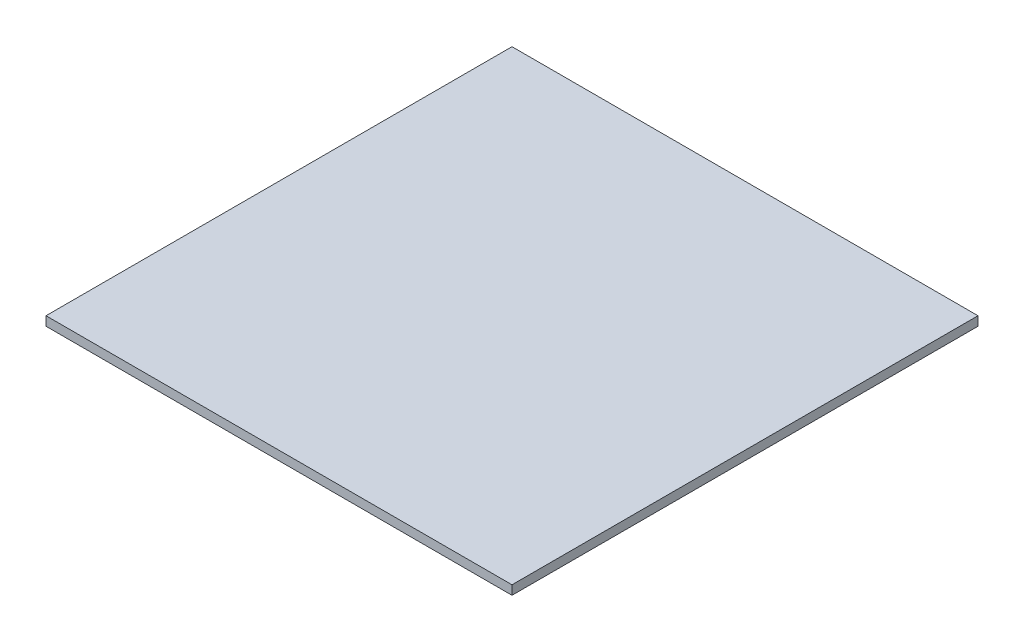
ISO-10303-21;
HEADER;
FILE_DESCRIPTION(('STEP AP214'),'2;1');
FILE_NAME('part.step','',(''),(''),'','','');
FILE_SCHEMA(('AUTOMOTIVE_DESIGN { 1 0 10303 214 1 1 1 1 }'));
ENDSEC;
DATA;
#1=APPLICATION_CONTEXT('core data for automotive mechanical design processes');
#2=APPLICATION_PROTOCOL_DEFINITION('international standard','automotive_design',2000,#1);
#3=PRODUCT_CONTEXT('',#1,'mechanical');
#4=PRODUCT('Part','Part','',(#3));
#5=PRODUCT_RELATED_PRODUCT_CATEGORY('part','',(#4));
#6=PRODUCT_DEFINITION_FORMATION('','',#4);
#7=PRODUCT_DEFINITION_CONTEXT('part definition',#1,'design');
#8=PRODUCT_DEFINITION('design','',#6,#7);
#9=PRODUCT_DEFINITION_SHAPE('','',#8);
#10=(LENGTH_UNIT() NAMED_UNIT(*) SI_UNIT(.MILLI.,.METRE.));
#11=(NAMED_UNIT(*) PLANE_ANGLE_UNIT() SI_UNIT($,.RADIAN.));
#12=(NAMED_UNIT(*) SI_UNIT($,.STERADIAN.) SOLID_ANGLE_UNIT());
#13=UNCERTAINTY_MEASURE_WITH_UNIT(LENGTH_MEASURE(1.E-05),#10,'distance_accuracy_value','');
#14=(GEOMETRIC_REPRESENTATION_CONTEXT(3) GLOBAL_UNCERTAINTY_ASSIGNED_CONTEXT((#13)) GLOBAL_UNIT_ASSIGNED_CONTEXT((#10,
#11,#12)) REPRESENTATION_CONTEXT('',''));
#15=CARTESIAN_POINT('',(0.,0.,0.));
#16=DIRECTION('',(0.,0.,1.));
#17=DIRECTION('',(1.,0.,0.));
#18=AXIS2_PLACEMENT_3D('',#15,#16,#17);
#19=CARTESIAN_POINT('',(0.,10.,0.));
#20=DIRECTION('',(1.,0.,0.));
#21=DIRECTION('',(0.,0.,-1.));
#22=AXIS2_PLACEMENT_3D('',#19,#20,#21);
#23=PLANE('',#22);
#24=DIRECTION('',(0.,0.,1.));
#25=VECTOR('',#24,1.);
#26=CARTESIAN_POINT('',(0.,0.,0.));
#27=LINE('',#26,#25);
#28=CARTESIAN_POINT('',(0.,0.,0.));
#29=VERTEX_POINT('',#28);
#30=CARTESIAN_POINT('',(0.,0.,510.));
#31=VERTEX_POINT('',#30);
#32=EDGE_CURVE('E106',#29,#31,#27,.T.);
#33=ORIENTED_EDGE('',*,*,#32,.T.);
#34=DIRECTION('',(0.,-1.,0.));
#35=VECTOR('',#34,1.);
#36=CARTESIAN_POINT('',(0.,10.,510.));
#37=LINE('',#36,#35);
#38=CARTESIAN_POINT('',(0.,10.,510.));
#39=VERTEX_POINT('',#38);
#40=EDGE_CURVE('E11',#39,#31,#37,.T.);
#41=ORIENTED_EDGE('',*,*,#40,.F.);
#42=DIRECTION('',(0.,0.,1.));
#43=VECTOR('',#42,1.);
#44=CARTESIAN_POINT('',(0.,10.,0.));
#45=LINE('',#44,#43);
#46=CARTESIAN_POINT('',(0.,10.,0.));
#47=VERTEX_POINT('',#46);
#48=EDGE_CURVE('E94',#47,#39,#45,.T.);
#49=ORIENTED_EDGE('',*,*,#48,.F.);
#50=DIRECTION('',(0.,-1.,0.));
#51=VECTOR('',#50,1.);
#52=CARTESIAN_POINT('',(0.,10.,0.));
#53=LINE('',#52,#51);
#54=EDGE_CURVE('E102',#47,#29,#53,.T.);
#55=ORIENTED_EDGE('',*,*,#54,.T.);
#56=EDGE_LOOP('',(#33,#41,#49,#55));
#57=FACE_BOUND('',#56,.T.);
#58=ADVANCED_FACE('F43',(#57),#23,.F.);
#59=CARTESIAN_POINT('',(0.,10.,510.));
#60=DIRECTION('',(0.,0.,-1.));
#61=DIRECTION('',(-1.,0.,0.));
#62=AXIS2_PLACEMENT_3D('',#59,#60,#61);
#63=PLANE('',#62);
#64=DIRECTION('',(1.,0.,0.));
#65=VECTOR('',#64,1.);
#66=CARTESIAN_POINT('',(0.,0.,510.));
#67=LINE('',#66,#65);
#68=CARTESIAN_POINT('',(510.,0.,510.));
#69=VERTEX_POINT('',#68);
#70=EDGE_CURVE('E98',#31,#69,#67,.T.);
#71=ORIENTED_EDGE('',*,*,#70,.T.);
#72=DIRECTION('',(0.,-1.,0.));
#73=VECTOR('',#72,1.);
#74=CARTESIAN_POINT('',(510.,10.,510.));
#75=LINE('',#74,#73);
#76=CARTESIAN_POINT('',(510.,10.,510.));
#77=VERTEX_POINT('',#76);
#78=EDGE_CURVE('E51',#77,#69,#75,.T.);
#79=ORIENTED_EDGE('',*,*,#78,.F.);
#80=DIRECTION('',(1.,0.,0.));
#81=VECTOR('',#80,1.);
#82=CARTESIAN_POINT('',(0.,10.,510.));
#83=LINE('',#82,#81);
#84=EDGE_CURVE('E89',#39,#77,#83,.T.);
#85=ORIENTED_EDGE('',*,*,#84,.F.);
#86=ORIENTED_EDGE('',*,*,#40,.T.);
#87=EDGE_LOOP('',(#71,#79,#85,#86));
#88=FACE_BOUND('',#87,.T.);
#89=ADVANCED_FACE('F97',(#88),#63,.F.);
#90=CARTESIAN_POINT('',(510.,10.,0.));
#91=DIRECTION('',(-1.,0.,0.));
#92=DIRECTION('',(0.,0.,1.));
#93=AXIS2_PLACEMENT_3D('',#90,#91,#92);
#94=PLANE('',#93);
#95=DIRECTION('',(0.,0.,-1.));
#96=VECTOR('',#95,1.);
#97=CARTESIAN_POINT('',(510.,0.,0.));
#98=LINE('',#97,#96);
#99=CARTESIAN_POINT('',(510.,0.,0.));
#100=VERTEX_POINT('',#99);
#101=EDGE_CURVE('E76',#69,#100,#98,.T.);
#102=ORIENTED_EDGE('',*,*,#101,.T.);
#103=DIRECTION('',(0.,-1.,0.));
#104=VECTOR('',#103,1.);
#105=CARTESIAN_POINT('',(510.,10.,0.));
#106=LINE('',#105,#104);
#107=CARTESIAN_POINT('',(510.,10.,0.));
#108=VERTEX_POINT('',#107);
#109=EDGE_CURVE('E99',#108,#100,#106,.T.);
#110=ORIENTED_EDGE('',*,*,#109,.F.);
#111=DIRECTION('',(0.,0.,-1.));
#112=VECTOR('',#111,1.);
#113=CARTESIAN_POINT('',(510.,10.,0.));
#114=LINE('',#113,#112);
#115=EDGE_CURVE('E92',#77,#108,#114,.T.);
#116=ORIENTED_EDGE('',*,*,#115,.F.);
#117=ORIENTED_EDGE('',*,*,#78,.T.);
#118=EDGE_LOOP('',(#102,#110,#116,#117));
#119=FACE_BOUND('',#118,.T.);
#120=ADVANCED_FACE('F100',(#119),#94,.F.);
#121=CARTESIAN_POINT('',(0.,10.,0.));
#122=DIRECTION('',(0.,0.,1.));
#123=DIRECTION('',(1.,0.,0.));
#124=AXIS2_PLACEMENT_3D('',#121,#122,#123);
#125=PLANE('',#124);
#126=DIRECTION('',(-1.,0.,0.));
#127=VECTOR('',#126,1.);
#128=CARTESIAN_POINT('',(0.,0.,0.));
#129=LINE('',#128,#127);
#130=EDGE_CURVE('E82',#100,#29,#129,.T.);
#131=ORIENTED_EDGE('',*,*,#130,.T.);
#132=ORIENTED_EDGE('',*,*,#54,.F.);
#133=DIRECTION('',(-1.,0.,0.));
#134=VECTOR('',#133,1.);
#135=CARTESIAN_POINT('',(0.,10.,0.));
#136=LINE('',#135,#134);
#137=EDGE_CURVE('E59',#108,#47,#136,.T.);
#138=ORIENTED_EDGE('',*,*,#137,.F.);
#139=ORIENTED_EDGE('',*,*,#109,.T.);
#140=EDGE_LOOP('',(#131,#132,#138,#139));
#141=FACE_BOUND('',#140,.T.);
#142=ADVANCED_FACE('F113',(#141),#125,.F.);
#143=CARTESIAN_POINT('',(0.,10.,0.));
#144=DIRECTION('',(0.,1.,0.));
#145=DIRECTION('',(0.,0.,1.));
#146=AXIS2_PLACEMENT_3D('',#143,#144,#145);
#147=PLANE('',#146);
#148=ORIENTED_EDGE('',*,*,#48,.T.);
#149=ORIENTED_EDGE('',*,*,#84,.T.);
#150=ORIENTED_EDGE('',*,*,#115,.T.);
#151=ORIENTED_EDGE('',*,*,#137,.T.);
#152=EDGE_LOOP('',(#148,#149,#150,#151));
#153=FACE_BOUND('',#152,.T.);
#154=ADVANCED_FACE('F90',(#153),#147,.T.);
#155=CARTESIAN_POINT('',(0.,0.,0.));
#156=DIRECTION('',(0.,1.,0.));
#157=DIRECTION('',(0.,0.,1.));
#158=AXIS2_PLACEMENT_3D('',#155,#156,#157);
#159=PLANE('',#158);
#160=ORIENTED_EDGE('',*,*,#32,.F.);
#161=ORIENTED_EDGE('',*,*,#130,.F.);
#162=ORIENTED_EDGE('',*,*,#101,.F.);
#163=ORIENTED_EDGE('',*,*,#70,.F.);
#164=EDGE_LOOP('',(#160,#161,#162,#163));
#165=FACE_BOUND('',#164,.T.);
#166=ADVANCED_FACE('F116',(#165),#159,.F.);
#167=CLOSED_SHELL('',(#58,#89,#120,#142,#154,#166));
#168=MANIFOLD_SOLID_BREP('B2',#167);
#169=ADVANCED_BREP_SHAPE_REPRESENTATION('',(#18,#168),#14);
#170=SHAPE_DEFINITION_REPRESENTATION(#9,#169);
ENDSEC;
END-ISO-10303-21;
